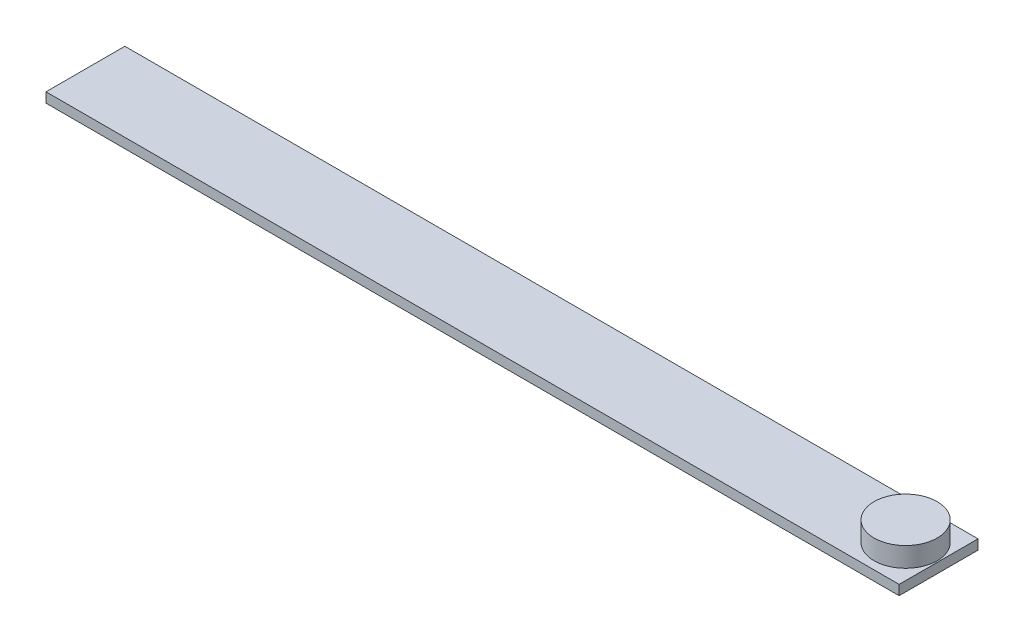
ISO-10303-21;
HEADER;
FILE_DESCRIPTION(('STEP AP214'),'2;1');
FILE_NAME('part.step','',(''),(''),'','','');
FILE_SCHEMA(('AUTOMOTIVE_DESIGN { 1 0 10303 214 1 1 1 1 }'));
ENDSEC;
DATA;
#1=APPLICATION_CONTEXT('core data for automotive mechanical design processes');
#2=APPLICATION_PROTOCOL_DEFINITION('international standard','automotive_design',2000,#1);
#3=PRODUCT_CONTEXT('',#1,'mechanical');
#4=PRODUCT('Part','Part','',(#3));
#5=PRODUCT_RELATED_PRODUCT_CATEGORY('part','',(#4));
#6=PRODUCT_DEFINITION_FORMATION('','',#4);
#7=PRODUCT_DEFINITION_CONTEXT('part definition',#1,'design');
#8=PRODUCT_DEFINITION('design','',#6,#7);
#9=PRODUCT_DEFINITION_SHAPE('','',#8);
#10=(LENGTH_UNIT() NAMED_UNIT(*) SI_UNIT(.MILLI.,.METRE.));
#11=(NAMED_UNIT(*) PLANE_ANGLE_UNIT() SI_UNIT($,.RADIAN.));
#12=(NAMED_UNIT(*) SI_UNIT($,.STERADIAN.) SOLID_ANGLE_UNIT());
#13=UNCERTAINTY_MEASURE_WITH_UNIT(LENGTH_MEASURE(1.E-05),#10,'distance_accuracy_value','');
#14=(GEOMETRIC_REPRESENTATION_CONTEXT(3) GLOBAL_UNCERTAINTY_ASSIGNED_CONTEXT((#13)) GLOBAL_UNIT_ASSIGNED_CONTEXT((#10,
#11,#12)) REPRESENTATION_CONTEXT('',''));
#15=CARTESIAN_POINT('',(0.,0.,0.));
#16=DIRECTION('',(0.,0.,1.));
#17=DIRECTION('',(1.,0.,0.));
#18=AXIS2_PLACEMENT_3D('',#15,#16,#17);
#19=CARTESIAN_POINT('',(0.,0.,25.4));
#20=DIRECTION('',(1.,0.,0.));
#21=DIRECTION('',(0.,0.,-1.));
#22=AXIS2_PLACEMENT_3D('',#19,#20,#21);
#23=PLANE('',#22);
#24=DIRECTION('',(0.,-1.,0.));
#25=VECTOR('',#24,1.);
#26=CARTESIAN_POINT('',(0.,0.,0.));
#27=LINE('',#26,#25);
#28=CARTESIAN_POINT('',(0.,3.175,0.));
#29=VERTEX_POINT('',#28);
#30=CARTESIAN_POINT('',(0.,0.,0.));
#31=VERTEX_POINT('',#30);
#32=EDGE_CURVE('E99',#29,#31,#27,.T.);
#33=ORIENTED_EDGE('',*,*,#32,.T.);
#34=DIRECTION('',(0.,0.,-1.));
#35=VECTOR('',#34,1.);
#36=CARTESIAN_POINT('',(0.,0.,25.4));
#37=LINE('',#36,#35);
#38=CARTESIAN_POINT('',(0.,0.,25.4));
#39=VERTEX_POINT('',#38);
#40=EDGE_CURVE('E41',#39,#31,#37,.T.);
#41=ORIENTED_EDGE('',*,*,#40,.F.);
#42=DIRECTION('',(0.,-1.,0.));
#43=VECTOR('',#42,1.);
#44=CARTESIAN_POINT('',(0.,0.,25.4));
#45=LINE('',#44,#43);
#46=CARTESIAN_POINT('',(0.,3.175,25.4));
#47=VERTEX_POINT('',#46);
#48=EDGE_CURVE('E85',#47,#39,#45,.T.);
#49=ORIENTED_EDGE('',*,*,#48,.F.);
#50=DIRECTION('',(0.,0.,-1.));
#51=VECTOR('',#50,1.);
#52=CARTESIAN_POINT('',(0.,3.175,25.4));
#53=LINE('',#52,#51);
#54=EDGE_CURVE('E95',#47,#29,#53,.T.);
#55=ORIENTED_EDGE('',*,*,#54,.T.);
#56=EDGE_LOOP('',(#33,#41,#49,#55));
#57=FACE_BOUND('',#56,.T.);
#58=ADVANCED_FACE('F33',(#57),#23,.F.);
#59=CARTESIAN_POINT('',(0.,0.,25.4));
#60=DIRECTION('',(0.,1.,0.));
#61=DIRECTION('',(0.,0.,1.));
#62=AXIS2_PLACEMENT_3D('',#59,#60,#61);
#63=PLANE('',#62);
#64=DIRECTION('',(1.,0.,0.));
#65=VECTOR('',#64,1.);
#66=CARTESIAN_POINT('',(0.,0.,0.));
#67=LINE('',#66,#65);
#68=CARTESIAN_POINT('',(274.7645,0.,0.));
#69=VERTEX_POINT('',#68);
#70=EDGE_CURVE('E90',#31,#69,#67,.T.);
#71=ORIENTED_EDGE('',*,*,#70,.T.);
#72=DIRECTION('',(0.,0.,-1.));
#73=VECTOR('',#72,1.);
#74=CARTESIAN_POINT('',(274.7645,0.,25.4));
#75=LINE('',#74,#73);
#76=CARTESIAN_POINT('',(274.7645,0.,25.4));
#77=VERTEX_POINT('',#76);
#78=EDGE_CURVE('E88',#77,#69,#75,.T.);
#79=ORIENTED_EDGE('',*,*,#78,.F.);
#80=DIRECTION('',(1.,0.,0.));
#81=VECTOR('',#80,1.);
#82=CARTESIAN_POINT('',(0.,0.,25.4));
#83=LINE('',#82,#81);
#84=EDGE_CURVE('E80',#39,#77,#83,.T.);
#85=ORIENTED_EDGE('',*,*,#84,.F.);
#86=ORIENTED_EDGE('',*,*,#40,.T.);
#87=EDGE_LOOP('',(#71,#79,#85,#86));
#88=FACE_BOUND('',#87,.T.);
#89=ADVANCED_FACE('F89',(#88),#63,.F.);
#90=CARTESIAN_POINT('',(274.7645,0.,25.4));
#91=DIRECTION('',(-1.,0.,0.));
#92=DIRECTION('',(0.,0.,1.));
#93=AXIS2_PLACEMENT_3D('',#90,#91,#92);
#94=PLANE('',#93);
#95=DIRECTION('',(0.,1.,0.));
#96=VECTOR('',#95,1.);
#97=CARTESIAN_POINT('',(274.7645,0.,0.));
#98=LINE('',#97,#96);
#99=CARTESIAN_POINT('',(274.7645,3.175,0.));
#100=VERTEX_POINT('',#99);
#101=EDGE_CURVE('E66',#69,#100,#98,.T.);
#102=ORIENTED_EDGE('',*,*,#101,.T.);
#103=DIRECTION('',(0.,0.,-1.));
#104=VECTOR('',#103,1.);
#105=CARTESIAN_POINT('',(274.7645,3.175,25.4));
#106=LINE('',#105,#104);
#107=CARTESIAN_POINT('',(274.7645,3.175,25.4));
#108=VERTEX_POINT('',#107);
#109=EDGE_CURVE('E91',#108,#100,#106,.T.);
#110=ORIENTED_EDGE('',*,*,#109,.F.);
#111=DIRECTION('',(0.,1.,0.));
#112=VECTOR('',#111,1.);
#113=CARTESIAN_POINT('',(274.7645,0.,25.4));
#114=LINE('',#113,#112);
#115=EDGE_CURVE('E83',#77,#108,#114,.T.);
#116=ORIENTED_EDGE('',*,*,#115,.F.);
#117=ORIENTED_EDGE('',*,*,#78,.T.);
#118=EDGE_LOOP('',(#102,#110,#116,#117));
#119=FACE_BOUND('',#118,.T.);
#120=ADVANCED_FACE('F93',(#119),#94,.F.);
#121=CARTESIAN_POINT('',(0.,3.175,25.4));
#122=DIRECTION('',(0.,-1.,0.));
#123=DIRECTION('',(0.,0.,-1.));
#124=AXIS2_PLACEMENT_3D('',#121,#122,#123);
#125=PLANE('',#124);
#126=CARTESIAN_POINT('',(264.16,3.175,12.7));
#127=DIRECTION('',(0.,-1.,0.));
#128=DIRECTION('',(0.,0.,-1.));
#129=AXIS2_PLACEMENT_3D('',#126,#127,#128);
#130=CIRCLE('',#129,10.16);
#131=CARTESIAN_POINT('',(264.16,3.175,2.54000000000002));
#132=VERTEX_POINT('',#131);
#133=EDGE_CURVE('E11',#132,#132,#130,.F.);
#134=ORIENTED_EDGE('',*,*,#133,.F.);
#135=EDGE_LOOP('',(#134));
#136=FACE_BOUND('',#135,.T.);
#137=DIRECTION('',(-1.,0.,0.));
#138=VECTOR('',#137,1.);
#139=CARTESIAN_POINT('',(0.,3.175,0.));
#140=LINE('',#139,#138);
#141=EDGE_CURVE('E72',#100,#29,#140,.T.);
#142=ORIENTED_EDGE('',*,*,#141,.T.);
#143=ORIENTED_EDGE('',*,*,#54,.F.);
#144=DIRECTION('',(-1.,0.,0.));
#145=VECTOR('',#144,1.);
#146=CARTESIAN_POINT('',(0.,3.175,25.4));
#147=LINE('',#146,#145);
#148=EDGE_CURVE('E49',#108,#47,#147,.T.);
#149=ORIENTED_EDGE('',*,*,#148,.F.);
#150=ORIENTED_EDGE('',*,*,#109,.T.);
#151=EDGE_LOOP('',(#142,#143,#149,#150));
#152=FACE_BOUND('',#151,.T.);
#153=ADVANCED_FACE('F121',(#136,#152),#125,.F.);
#154=CARTESIAN_POINT('',(0.,0.,25.4));
#155=DIRECTION('',(0.,0.,-1.));
#156=DIRECTION('',(-1.,0.,0.));
#157=AXIS2_PLACEMENT_3D('',#154,#155,#156);
#158=PLANE('',#157);
#159=ORIENTED_EDGE('',*,*,#48,.T.);
#160=ORIENTED_EDGE('',*,*,#84,.T.);
#161=ORIENTED_EDGE('',*,*,#115,.T.);
#162=ORIENTED_EDGE('',*,*,#148,.T.);
#163=EDGE_LOOP('',(#159,#160,#161,#162));
#164=FACE_BOUND('',#163,.T.);
#165=ADVANCED_FACE('F81',(#164),#158,.F.);
#166=CARTESIAN_POINT('',(0.,0.,0.));
#167=DIRECTION('',(0.,0.,-1.));
#168=DIRECTION('',(-1.,0.,0.));
#169=AXIS2_PLACEMENT_3D('',#166,#167,#168);
#170=PLANE('',#169);
#171=ORIENTED_EDGE('',*,*,#32,.F.);
#172=ORIENTED_EDGE('',*,*,#141,.F.);
#173=ORIENTED_EDGE('',*,*,#101,.F.);
#174=ORIENTED_EDGE('',*,*,#70,.F.);
#175=EDGE_LOOP('',(#171,#172,#173,#174));
#176=FACE_BOUND('',#175,.T.);
#177=ADVANCED_FACE('F110',(#176),#170,.T.);
#178=CARTESIAN_POINT('',(264.16,9.525,12.7));
#179=DIRECTION('',(0.,-1.,0.));
#180=DIRECTION('',(0.,0.,-1.));
#181=AXIS2_PLACEMENT_3D('',#178,#179,#180);
#182=CYLINDRICAL_SURFACE('',#181,10.16);
#183=CARTESIAN_POINT('',(264.16,9.525,12.7));
#184=DIRECTION('',(0.,1.,0.));
#185=DIRECTION('',(0.,0.,1.));
#186=AXIS2_PLACEMENT_3D('',#183,#184,#185);
#187=CIRCLE('',#186,10.16);
#188=CARTESIAN_POINT('',(264.16,9.525,22.86));
#189=VERTEX_POINT('',#188);
#190=EDGE_CURVE('E102',#189,#189,#187,.T.);
#191=ORIENTED_EDGE('',*,*,#190,.F.);
#192=EDGE_LOOP('',(#191));
#193=FACE_BOUND('',#192,.T.);
#194=ORIENTED_EDGE('',*,*,#133,.T.);
#195=EDGE_LOOP('',(#194));
#196=FACE_BOUND('',#195,.T.);
#197=ADVANCED_FACE('F112',(#193,#196),#182,.T.);
#198=CARTESIAN_POINT('',(264.16,9.525,12.7));
#199=DIRECTION('',(0.,1.,0.));
#200=DIRECTION('',(0.,0.,1.));
#201=AXIS2_PLACEMENT_3D('',#198,#199,#200);
#202=PLANE('',#201);
#203=ORIENTED_EDGE('',*,*,#190,.T.);
#204=EDGE_LOOP('',(#203));
#205=FACE_BOUND('',#204,.T.);
#206=ADVANCED_FACE('F118',(#205),#202,.T.);
#207=CLOSED_SHELL('',(#58,#89,#120,#153,#165,#177,#197,#206));
#208=MANIFOLD_SOLID_BREP('B2',#207);
#209=ADVANCED_BREP_SHAPE_REPRESENTATION('',(#18,#208),#14);
#210=SHAPE_DEFINITION_REPRESENTATION(#9,#209);
ENDSEC;
END-ISO-10303-21;
